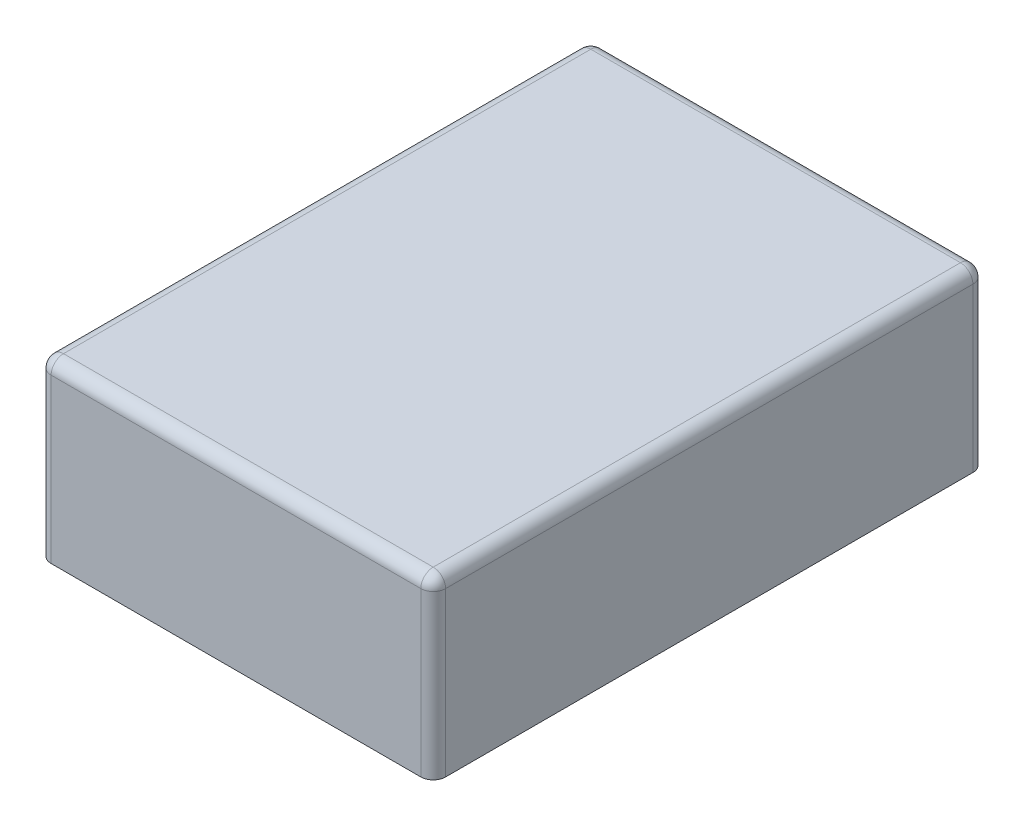
ISO-10303-21;
HEADER;
FILE_DESCRIPTION(('STEP AP214'),'2;1');
FILE_NAME('part.step','',(''),(''),'','','');
FILE_SCHEMA(('AUTOMOTIVE_DESIGN { 1 0 10303 214 1 1 1 1 }'));
ENDSEC;
DATA;
#1=APPLICATION_CONTEXT('core data for automotive mechanical design processes');
#2=APPLICATION_PROTOCOL_DEFINITION('international standard','automotive_design',2000,#1);
#3=PRODUCT_CONTEXT('',#1,'mechanical');
#4=PRODUCT('Part','Part','',(#3));
#5=PRODUCT_RELATED_PRODUCT_CATEGORY('part','',(#4));
#6=PRODUCT_DEFINITION_FORMATION('','',#4);
#7=PRODUCT_DEFINITION_CONTEXT('part definition',#1,'design');
#8=PRODUCT_DEFINITION('design','',#6,#7);
#9=PRODUCT_DEFINITION_SHAPE('','',#8);
#10=(LENGTH_UNIT() NAMED_UNIT(*) SI_UNIT(.MILLI.,.METRE.));
#11=(NAMED_UNIT(*) PLANE_ANGLE_UNIT() SI_UNIT($,.RADIAN.));
#12=(NAMED_UNIT(*) SI_UNIT($,.STERADIAN.) SOLID_ANGLE_UNIT());
#13=UNCERTAINTY_MEASURE_WITH_UNIT(LENGTH_MEASURE(1.E-05),#10,'distance_accuracy_value','');
#14=(GEOMETRIC_REPRESENTATION_CONTEXT(3) GLOBAL_UNCERTAINTY_ASSIGNED_CONTEXT((#13)) GLOBAL_UNIT_ASSIGNED_CONTEXT((#10,
#11,#12)) REPRESENTATION_CONTEXT('',''));
#15=CARTESIAN_POINT('',(0.,0.,0.));
#16=DIRECTION('',(0.,0.,1.));
#17=DIRECTION('',(1.,0.,0.));
#18=AXIS2_PLACEMENT_3D('',#15,#16,#17);
#19=CARTESIAN_POINT('',(0.,0.,0.));
#20=DIRECTION('',(0.,1.,0.));
#21=DIRECTION('',(0.,0.,1.));
#22=AXIS2_PLACEMENT_3D('',#19,#20,#21);
#23=PLANE('',#22);
#24=DIRECTION('',(1.,0.,0.));
#25=VECTOR('',#24,1.);
#26=CARTESIAN_POINT('',(-45.2445008433846,0.,67.0766360111808));
#27=LINE('',#26,#25);
#28=CARTESIAN_POINT('',(-45.2445008433846,0.,67.0766360111808));
#29=VERTEX_POINT('',#28);
#30=CARTESIAN_POINT('',(44.1554991566154,0.,67.0766360111808));
#31=VERTEX_POINT('',#30);
#32=EDGE_CURVE('E213',#29,#31,#27,.T.);
#33=ORIENTED_EDGE('',*,*,#32,.F.);
#34=CARTESIAN_POINT('',(-45.2445008433846,0.,64.0766360111808));
#35=DIRECTION('',(0.,1.,0.));
#36=DIRECTION('',(0.,0.,1.));
#37=AXIS2_PLACEMENT_3D('',#34,#35,#36);
#38=CIRCLE('',#37,3.);
#39=CARTESIAN_POINT('',(-48.2445008433846,0.,64.0766360111808));
#40=VERTEX_POINT('',#39);
#41=EDGE_CURVE('E227',#29,#40,#38,.F.);
#42=ORIENTED_EDGE('',*,*,#41,.T.);
#43=DIRECTION('',(0.,0.,1.));
#44=VECTOR('',#43,1.);
#45=CARTESIAN_POINT('',(-48.2445008433846,0.,-63.4233639888192));
#46=LINE('',#45,#44);
#47=CARTESIAN_POINT('',(-48.2445008433846,0.,-63.4233639888192));
#48=VERTEX_POINT('',#47);
#49=EDGE_CURVE('E210',#48,#40,#46,.T.);
#50=ORIENTED_EDGE('',*,*,#49,.F.);
#51=CARTESIAN_POINT('',(-45.2445008433846,0.,-63.4233639888192));
#52=DIRECTION('',(0.,1.,0.));
#53=DIRECTION('',(0.,0.,1.));
#54=AXIS2_PLACEMENT_3D('',#51,#52,#53);
#55=CIRCLE('',#54,3.);
#56=CARTESIAN_POINT('',(-45.2445008433846,0.,-66.4233639888192));
#57=VERTEX_POINT('',#56);
#58=EDGE_CURVE('E221',#48,#57,#55,.F.);
#59=ORIENTED_EDGE('',*,*,#58,.T.);
#60=DIRECTION('',(-1.,0.,0.));
#61=VECTOR('',#60,1.);
#62=CARTESIAN_POINT('',(-45.2445008433846,0.,-66.4233639888192));
#63=LINE('',#62,#61);
#64=CARTESIAN_POINT('',(44.1554991566154,0.,-66.4233639888192));
#65=VERTEX_POINT('',#64);
#66=EDGE_CURVE('E207',#65,#57,#63,.T.);
#67=ORIENTED_EDGE('',*,*,#66,.F.);
#68=CARTESIAN_POINT('',(44.1554991566154,0.,-63.4233639888192));
#69=DIRECTION('',(0.,1.,0.));
#70=DIRECTION('',(0.,0.,1.));
#71=AXIS2_PLACEMENT_3D('',#68,#69,#70);
#72=CIRCLE('',#71,3.);
#73=CARTESIAN_POINT('',(47.1554991566154,0.,-63.4233639888192));
#74=VERTEX_POINT('',#73);
#75=EDGE_CURVE('E223',#65,#74,#72,.F.);
#76=ORIENTED_EDGE('',*,*,#75,.T.);
#77=DIRECTION('',(0.,0.,-1.));
#78=VECTOR('',#77,1.);
#79=CARTESIAN_POINT('',(47.1554991566154,0.,-63.4233639888192));
#80=LINE('',#79,#78);
#81=CARTESIAN_POINT('',(47.1554991566154,0.,64.0766360111808));
#82=VERTEX_POINT('',#81);
#83=EDGE_CURVE('E204',#82,#74,#80,.T.);
#84=ORIENTED_EDGE('',*,*,#83,.F.);
#85=CARTESIAN_POINT('',(44.1554991566154,0.,64.0766360111808));
#86=DIRECTION('',(0.,1.,0.));
#87=DIRECTION('',(0.,0.,1.));
#88=AXIS2_PLACEMENT_3D('',#85,#86,#87);
#89=CIRCLE('',#88,3.);
#90=EDGE_CURVE('E225',#82,#31,#89,.F.);
#91=ORIENTED_EDGE('',*,*,#90,.T.);
#92=EDGE_LOOP('',(#33,#42,#50,#59,#67,#76,#84,#91));
#93=FACE_BOUND('',#92,.T.);
#94=DIRECTION('',(0.,0.,-1.));
#95=VECTOR('',#94,1.);
#96=CARTESIAN_POINT('',(44.1554991566154,0.,-63.4233639888192));
#97=LINE('',#96,#95);
#98=CARTESIAN_POINT('',(44.1554991566154,0.,64.0766360111808));
#99=VERTEX_POINT('',#98);
#100=CARTESIAN_POINT('',(44.1554991566154,0.,-63.4233639888192));
#101=VERTEX_POINT('',#100);
#102=EDGE_CURVE('E190',#99,#101,#97,.T.);
#103=ORIENTED_EDGE('',*,*,#102,.T.);
#104=DIRECTION('',(-1.,0.,0.));
#105=VECTOR('',#104,1.);
#106=CARTESIAN_POINT('',(-45.2445008433846,0.,-63.4233639888192));
#107=LINE('',#106,#105);
#108=CARTESIAN_POINT('',(-45.2445008433846,0.,-63.4233639888192));
#109=VERTEX_POINT('',#108);
#110=EDGE_CURVE('E193',#101,#109,#107,.T.);
#111=ORIENTED_EDGE('',*,*,#110,.T.);
#112=DIRECTION('',(0.,0.,1.));
#113=VECTOR('',#112,1.);
#114=CARTESIAN_POINT('',(-45.2445008433846,0.,-63.4233639888192));
#115=LINE('',#114,#113);
#116=CARTESIAN_POINT('',(-45.2445008433846,0.,64.0766360111808));
#117=VERTEX_POINT('',#116);
#118=EDGE_CURVE('E196',#109,#117,#115,.T.);
#119=ORIENTED_EDGE('',*,*,#118,.T.);
#120=DIRECTION('',(1.,0.,0.));
#121=VECTOR('',#120,1.);
#122=CARTESIAN_POINT('',(-45.2445008433846,0.,64.0766360111808));
#123=LINE('',#122,#121);
#124=EDGE_CURVE('E177',#117,#99,#123,.T.);
#125=ORIENTED_EDGE('',*,*,#124,.T.);
#126=EDGE_LOOP('',(#103,#111,#119,#125));
#127=FACE_BOUND('',#126,.T.);
#128=ADVANCED_FACE('F59',(#93,#127),#23,.F.);
#129=CARTESIAN_POINT('',(47.1554991566154,37.45,-63.4233639888192));
#130=DIRECTION('',(-1.,0.,0.));
#131=DIRECTION('',(0.,0.,1.));
#132=AXIS2_PLACEMENT_3D('',#129,#130,#131);
#133=PLANE('',#132);
#134=DIRECTION('',(0.,-1.,0.));
#135=VECTOR('',#134,1.);
#136=CARTESIAN_POINT('',(47.1554991566154,37.45,-63.4233639888192));
#137=LINE('',#136,#135);
#138=CARTESIAN_POINT('',(47.1554991566154,39.45,-63.4233639888192));
#139=VERTEX_POINT('',#138);
#140=EDGE_CURVE('E234',#74,#139,#137,.F.);
#141=ORIENTED_EDGE('',*,*,#140,.T.);
#142=DIRECTION('',(0.,0.,-1.));
#143=VECTOR('',#142,1.);
#144=CARTESIAN_POINT('',(47.1554991566154,39.45,64.0766360111808));
#145=LINE('',#144,#143);
#146=CARTESIAN_POINT('',(47.1554991566154,39.45,64.0766360111808));
#147=VERTEX_POINT('',#146);
#148=EDGE_CURVE('E259',#139,#147,#145,.F.);
#149=ORIENTED_EDGE('',*,*,#148,.T.);
#150=DIRECTION('',(0.,-1.,0.));
#151=VECTOR('',#150,1.);
#152=CARTESIAN_POINT('',(47.1554991566154,37.45,64.0766360111808));
#153=LINE('',#152,#151);
#154=EDGE_CURVE('E237',#147,#82,#153,.T.);
#155=ORIENTED_EDGE('',*,*,#154,.T.);
#156=ORIENTED_EDGE('',*,*,#83,.T.);
#157=EDGE_LOOP('',(#141,#149,#155,#156));
#158=FACE_BOUND('',#157,.T.);
#159=ADVANCED_FACE('F352',(#158),#133,.F.);
#160=CARTESIAN_POINT('',(-45.2445008433846,37.45,-66.4233639888192));
#161=DIRECTION('',(0.,0.,1.));
#162=DIRECTION('',(1.,0.,0.));
#163=AXIS2_PLACEMENT_3D('',#160,#161,#162);
#164=PLANE('',#163);
#165=DIRECTION('',(0.,-1.,0.));
#166=VECTOR('',#165,1.);
#167=CARTESIAN_POINT('',(-45.2445008433846,37.45,-66.4233639888192));
#168=LINE('',#167,#166);
#169=CARTESIAN_POINT('',(-45.2445008433846,39.45,-66.4233639888192));
#170=VERTEX_POINT('',#169);
#171=EDGE_CURVE('E239',#57,#170,#168,.F.);
#172=ORIENTED_EDGE('',*,*,#171,.T.);
#173=DIRECTION('',(-1.,0.,0.));
#174=VECTOR('',#173,1.);
#175=CARTESIAN_POINT('',(44.1554991566154,39.45,-66.4233639888192));
#176=LINE('',#175,#174);
#177=CARTESIAN_POINT('',(44.1554991566154,39.45,-66.4233639888192));
#178=VERTEX_POINT('',#177);
#179=EDGE_CURVE('E12',#170,#178,#176,.F.);
#180=ORIENTED_EDGE('',*,*,#179,.T.);
#181=DIRECTION('',(0.,-1.,0.));
#182=VECTOR('',#181,1.);
#183=CARTESIAN_POINT('',(44.1554991566154,37.45,-66.4233639888192));
#184=LINE('',#183,#182);
#185=EDGE_CURVE('E242',#178,#65,#184,.T.);
#186=ORIENTED_EDGE('',*,*,#185,.T.);
#187=ORIENTED_EDGE('',*,*,#66,.T.);
#188=EDGE_LOOP('',(#172,#180,#186,#187));
#189=FACE_BOUND('',#188,.T.);
#190=ADVANCED_FACE('F335',(#189),#164,.F.);
#191=CARTESIAN_POINT('',(-48.2445008433846,37.45,-63.4233639888192));
#192=DIRECTION('',(1.,0.,0.));
#193=DIRECTION('',(0.,0.,-1.));
#194=AXIS2_PLACEMENT_3D('',#191,#192,#193);
#195=PLANE('',#194);
#196=DIRECTION('',(0.,-1.,0.));
#197=VECTOR('',#196,1.);
#198=CARTESIAN_POINT('',(-48.2445008433846,37.45,64.0766360111808));
#199=LINE('',#198,#197);
#200=CARTESIAN_POINT('',(-48.2445008433846,39.45,64.0766360111808));
#201=VERTEX_POINT('',#200);
#202=EDGE_CURVE('E231',#40,#201,#199,.F.);
#203=ORIENTED_EDGE('',*,*,#202,.T.);
#204=DIRECTION('',(0.,0.,1.));
#205=VECTOR('',#204,1.);
#206=CARTESIAN_POINT('',(-48.2445008433846,39.45,-63.4233639888192));
#207=LINE('',#206,#205);
#208=CARTESIAN_POINT('',(-48.2445008433846,39.45,-63.4233639888192));
#209=VERTEX_POINT('',#208);
#210=EDGE_CURVE('E68',#201,#209,#207,.F.);
#211=ORIENTED_EDGE('',*,*,#210,.T.);
#212=DIRECTION('',(0.,-1.,0.));
#213=VECTOR('',#212,1.);
#214=CARTESIAN_POINT('',(-48.2445008433846,37.45,-63.4233639888192));
#215=LINE('',#214,#213);
#216=EDGE_CURVE('E229',#209,#48,#215,.T.);
#217=ORIENTED_EDGE('',*,*,#216,.T.);
#218=ORIENTED_EDGE('',*,*,#49,.T.);
#219=EDGE_LOOP('',(#203,#211,#217,#218));
#220=FACE_BOUND('',#219,.T.);
#221=ADVANCED_FACE('F296',(#220),#195,.F.);
#222=CARTESIAN_POINT('',(-45.2445008433846,37.45,67.0766360111808));
#223=DIRECTION('',(0.,0.,-1.));
#224=DIRECTION('',(-1.,0.,0.));
#225=AXIS2_PLACEMENT_3D('',#222,#223,#224);
#226=PLANE('',#225);
#227=DIRECTION('',(0.,-1.,0.));
#228=VECTOR('',#227,1.);
#229=CARTESIAN_POINT('',(44.1554991566154,37.45,67.0766360111808));
#230=LINE('',#229,#228);
#231=CARTESIAN_POINT('',(44.1554991566154,39.45,67.0766360111808));
#232=VERTEX_POINT('',#231);
#233=EDGE_CURVE('E216',#31,#232,#230,.F.);
#234=ORIENTED_EDGE('',*,*,#233,.T.);
#235=DIRECTION('',(1.,0.,0.));
#236=VECTOR('',#235,1.);
#237=CARTESIAN_POINT('',(-45.2445008433846,39.45,67.0766360111808));
#238=LINE('',#237,#236);
#239=CARTESIAN_POINT('',(-45.2445008433846,39.45,67.0766360111808));
#240=VERTEX_POINT('',#239);
#241=EDGE_CURVE('E261',#232,#240,#238,.F.);
#242=ORIENTED_EDGE('',*,*,#241,.T.);
#243=DIRECTION('',(0.,-1.,0.));
#244=VECTOR('',#243,1.);
#245=CARTESIAN_POINT('',(-45.2445008433846,37.45,67.0766360111808));
#246=LINE('',#245,#244);
#247=EDGE_CURVE('E219',#240,#29,#246,.T.);
#248=ORIENTED_EDGE('',*,*,#247,.T.);
#249=ORIENTED_EDGE('',*,*,#32,.T.);
#250=EDGE_LOOP('',(#234,#242,#248,#249));
#251=FACE_BOUND('',#250,.T.);
#252=ADVANCED_FACE('F308',(#251),#226,.F.);
#253=CARTESIAN_POINT('',(44.1554991566154,37.45,-63.4233639888192));
#254=DIRECTION('',(-1.,0.,0.));
#255=DIRECTION('',(0.,0.,1.));
#256=AXIS2_PLACEMENT_3D('',#253,#254,#255);
#257=PLANE('',#256);
#258=ORIENTED_EDGE('',*,*,#102,.F.);
#259=DIRECTION('',(0.,-1.,0.));
#260=VECTOR('',#259,1.);
#261=CARTESIAN_POINT('',(44.1554991566154,37.45,64.0766360111808));
#262=LINE('',#261,#260);
#263=CARTESIAN_POINT('',(44.1554991566154,37.45,64.0766360111808));
#264=VERTEX_POINT('',#263);
#265=EDGE_CURVE('E171',#264,#99,#262,.T.);
#266=ORIENTED_EDGE('',*,*,#265,.F.);
#267=DIRECTION('',(0.,0.,-1.));
#268=VECTOR('',#267,1.);
#269=CARTESIAN_POINT('',(44.1554991566154,37.45,-63.4233639888192));
#270=LINE('',#269,#268);
#271=CARTESIAN_POINT('',(44.1554991566154,37.45,-63.4233639888192));
#272=VERTEX_POINT('',#271);
#273=EDGE_CURVE('E167',#264,#272,#270,.T.);
#274=ORIENTED_EDGE('',*,*,#273,.T.);
#275=DIRECTION('',(0.,-1.,0.));
#276=VECTOR('',#275,1.);
#277=CARTESIAN_POINT('',(44.1554991566154,37.45,-63.4233639888192));
#278=LINE('',#277,#276);
#279=EDGE_CURVE('E201',#272,#101,#278,.T.);
#280=ORIENTED_EDGE('',*,*,#279,.T.);
#281=EDGE_LOOP('',(#258,#266,#274,#280));
#282=FACE_BOUND('',#281,.T.);
#283=ADVANCED_FACE('F361',(#282),#257,.T.);
#284=CARTESIAN_POINT('',(-45.2445008433846,37.45,-63.4233639888192));
#285=DIRECTION('',(0.,0.,1.));
#286=DIRECTION('',(1.,0.,0.));
#287=AXIS2_PLACEMENT_3D('',#284,#285,#286);
#288=PLANE('',#287);
#289=ORIENTED_EDGE('',*,*,#110,.F.);
#290=ORIENTED_EDGE('',*,*,#279,.F.);
#291=DIRECTION('',(-1.,0.,0.));
#292=VECTOR('',#291,1.);
#293=CARTESIAN_POINT('',(-45.2445008433846,37.45,-63.4233639888192));
#294=LINE('',#293,#292);
#295=CARTESIAN_POINT('',(-45.2445008433846,37.45,-63.4233639888192));
#296=VERTEX_POINT('',#295);
#297=EDGE_CURVE('E185',#272,#296,#294,.T.);
#298=ORIENTED_EDGE('',*,*,#297,.T.);
#299=DIRECTION('',(0.,-1.,0.));
#300=VECTOR('',#299,1.);
#301=CARTESIAN_POINT('',(-45.2445008433846,37.45,-63.4233639888192));
#302=LINE('',#301,#300);
#303=EDGE_CURVE('E181',#296,#109,#302,.T.);
#304=ORIENTED_EDGE('',*,*,#303,.T.);
#305=EDGE_LOOP('',(#289,#290,#298,#304));
#306=FACE_BOUND('',#305,.T.);
#307=ADVANCED_FACE('F527',(#306),#288,.T.);
#308=CARTESIAN_POINT('',(-45.2445008433846,37.45,-63.4233639888192));
#309=DIRECTION('',(1.,0.,0.));
#310=DIRECTION('',(0.,0.,-1.));
#311=AXIS2_PLACEMENT_3D('',#308,#309,#310);
#312=PLANE('',#311);
#313=ORIENTED_EDGE('',*,*,#118,.F.);
#314=ORIENTED_EDGE('',*,*,#303,.F.);
#315=DIRECTION('',(0.,0.,1.));
#316=VECTOR('',#315,1.);
#317=CARTESIAN_POINT('',(-45.2445008433846,37.45,-63.4233639888192));
#318=LINE('',#317,#316);
#319=CARTESIAN_POINT('',(-45.2445008433846,37.45,64.0766360111808));
#320=VERTEX_POINT('',#319);
#321=EDGE_CURVE('E164',#296,#320,#318,.T.);
#322=ORIENTED_EDGE('',*,*,#321,.T.);
#323=DIRECTION('',(0.,-1.,0.));
#324=VECTOR('',#323,1.);
#325=CARTESIAN_POINT('',(-45.2445008433846,37.45,64.0766360111808));
#326=LINE('',#325,#324);
#327=EDGE_CURVE('E174',#320,#117,#326,.T.);
#328=ORIENTED_EDGE('',*,*,#327,.T.);
#329=EDGE_LOOP('',(#313,#314,#322,#328));
#330=FACE_BOUND('',#329,.T.);
#331=ADVANCED_FACE('F184',(#330),#312,.T.);
#332=CARTESIAN_POINT('',(-45.2445008433846,37.45,64.0766360111808));
#333=DIRECTION('',(0.,0.,-1.));
#334=DIRECTION('',(-1.,0.,0.));
#335=AXIS2_PLACEMENT_3D('',#332,#333,#334);
#336=PLANE('',#335);
#337=ORIENTED_EDGE('',*,*,#124,.F.);
#338=ORIENTED_EDGE('',*,*,#327,.F.);
#339=DIRECTION('',(1.,0.,0.));
#340=VECTOR('',#339,1.);
#341=CARTESIAN_POINT('',(-45.2445008433846,37.45,64.0766360111808));
#342=LINE('',#341,#340);
#343=EDGE_CURVE('E160',#320,#264,#342,.T.);
#344=ORIENTED_EDGE('',*,*,#343,.T.);
#345=ORIENTED_EDGE('',*,*,#265,.T.);
#346=EDGE_LOOP('',(#337,#338,#344,#345));
#347=FACE_BOUND('',#346,.T.);
#348=ADVANCED_FACE('F175',(#347),#336,.T.);
#349=CARTESIAN_POINT('',(0.,37.45,0.));
#350=DIRECTION('',(0.,1.,0.));
#351=DIRECTION('',(0.,0.,1.));
#352=AXIS2_PLACEMENT_3D('',#349,#350,#351);
#353=PLANE('',#352);
#354=ORIENTED_EDGE('',*,*,#273,.F.);
#355=ORIENTED_EDGE('',*,*,#343,.F.);
#356=ORIENTED_EDGE('',*,*,#321,.F.);
#357=ORIENTED_EDGE('',*,*,#297,.F.);
#358=EDGE_LOOP('',(#354,#355,#356,#357));
#359=FACE_BOUND('',#358,.T.);
#360=ADVANCED_FACE('F162',(#359),#353,.F.);
#361=CARTESIAN_POINT('',(0.,42.45,0.));
#362=DIRECTION('',(0.,1.,0.));
#363=DIRECTION('',(0.,0.,1.));
#364=AXIS2_PLACEMENT_3D('',#361,#362,#363);
#365=PLANE('',#364);
#366=DIRECTION('',(1.,0.,0.));
#367=VECTOR('',#366,1.);
#368=CARTESIAN_POINT('',(44.1554991566154,42.45,64.0766360111808));
#369=LINE('',#368,#367);
#370=CARTESIAN_POINT('',(-45.2445008433846,42.45,64.0766360111808));
#371=VERTEX_POINT('',#370);
#372=CARTESIAN_POINT('',(44.1554991566154,42.45,64.0766360111808));
#373=VERTEX_POINT('',#372);
#374=EDGE_CURVE('E76',#371,#373,#369,.T.);
#375=ORIENTED_EDGE('',*,*,#374,.T.);
#376=DIRECTION('',(0.,0.,-1.));
#377=VECTOR('',#376,1.);
#378=CARTESIAN_POINT('',(44.1554991566154,42.45,-63.4233639888192));
#379=LINE('',#378,#377);
#380=CARTESIAN_POINT('',(44.1554991566154,42.45,-63.4233639888192));
#381=VERTEX_POINT('',#380);
#382=EDGE_CURVE('E257',#373,#381,#379,.T.);
#383=ORIENTED_EDGE('',*,*,#382,.T.);
#384=DIRECTION('',(-1.,0.,0.));
#385=VECTOR('',#384,1.);
#386=CARTESIAN_POINT('',(-45.2445008433846,42.45,-63.4233639888192));
#387=LINE('',#386,#385);
#388=CARTESIAN_POINT('',(-45.2445008433846,42.45,-63.4233639888192));
#389=VERTEX_POINT('',#388);
#390=EDGE_CURVE('E253',#381,#389,#387,.T.);
#391=ORIENTED_EDGE('',*,*,#390,.T.);
#392=DIRECTION('',(0.,0.,1.));
#393=VECTOR('',#392,1.);
#394=CARTESIAN_POINT('',(-45.2445008433846,42.45,64.0766360111808));
#395=LINE('',#394,#393);
#396=EDGE_CURVE('E81',#389,#371,#395,.T.);
#397=ORIENTED_EDGE('',*,*,#396,.T.);
#398=EDGE_LOOP('',(#375,#383,#391,#397));
#399=FACE_BOUND('',#398,.T.);
#400=ADVANCED_FACE('F322',(#399),#365,.T.);
#401=CARTESIAN_POINT('',(-45.2445008433846,37.45,64.0766360111808));
#402=DIRECTION('',(0.,-1.,0.));
#403=DIRECTION('',(0.,0.,-1.));
#404=AXIS2_PLACEMENT_3D('',#401,#402,#403);
#405=CYLINDRICAL_SURFACE('',#404,3.);
#406=ORIENTED_EDGE('',*,*,#247,.F.);
#407=CARTESIAN_POINT('',(-45.2445008433846,39.45,64.0766360111808));
#408=DIRECTION('',(0.,-1.,0.));
#409=DIRECTION('',(0.,0.,-1.));
#410=AXIS2_PLACEMENT_3D('',#407,#408,#409);
#411=CIRCLE('',#410,3.);
#412=EDGE_CURVE('E249',#240,#201,#411,.T.);
#413=ORIENTED_EDGE('',*,*,#412,.T.);
#414=ORIENTED_EDGE('',*,*,#202,.F.);
#415=ORIENTED_EDGE('',*,*,#41,.F.);
#416=EDGE_LOOP('',(#406,#413,#414,#415));
#417=FACE_BOUND('',#416,.T.);
#418=ADVANCED_FACE('F293',(#417),#405,.T.);
#419=CARTESIAN_POINT('',(44.1554991566154,37.45,64.0766360111808));
#420=DIRECTION('',(0.,-1.,0.));
#421=DIRECTION('',(0.,0.,-1.));
#422=AXIS2_PLACEMENT_3D('',#419,#420,#421);
#423=CYLINDRICAL_SURFACE('',#422,3.);
#424=ORIENTED_EDGE('',*,*,#154,.F.);
#425=CARTESIAN_POINT('',(44.1554991566154,39.45,64.0766360111808));
#426=DIRECTION('',(0.,-1.,0.));
#427=DIRECTION('',(0.,0.,-1.));
#428=AXIS2_PLACEMENT_3D('',#425,#426,#427);
#429=CIRCLE('',#428,3.);
#430=EDGE_CURVE('E247',#147,#232,#429,.T.);
#431=ORIENTED_EDGE('',*,*,#430,.T.);
#432=ORIENTED_EDGE('',*,*,#233,.F.);
#433=ORIENTED_EDGE('',*,*,#90,.F.);
#434=EDGE_LOOP('',(#424,#431,#432,#433));
#435=FACE_BOUND('',#434,.T.);
#436=ADVANCED_FACE('F311',(#435),#423,.T.);
#437=CARTESIAN_POINT('',(44.1554991566154,37.45,-63.4233639888192));
#438=DIRECTION('',(0.,-1.,0.));
#439=DIRECTION('',(0.,0.,-1.));
#440=AXIS2_PLACEMENT_3D('',#437,#438,#439);
#441=CYLINDRICAL_SURFACE('',#440,3.);
#442=ORIENTED_EDGE('',*,*,#185,.F.);
#443=CARTESIAN_POINT('',(44.1554991566154,39.45,-63.4233639888192));
#444=DIRECTION('',(0.,-1.,0.));
#445=DIRECTION('',(0.,0.,-1.));
#446=AXIS2_PLACEMENT_3D('',#443,#444,#445);
#447=CIRCLE('',#446,3.);
#448=EDGE_CURVE('E244',#178,#139,#447,.T.);
#449=ORIENTED_EDGE('',*,*,#448,.T.);
#450=ORIENTED_EDGE('',*,*,#140,.F.);
#451=ORIENTED_EDGE('',*,*,#75,.F.);
#452=EDGE_LOOP('',(#442,#449,#450,#451));
#453=FACE_BOUND('',#452,.T.);
#454=ADVANCED_FACE('F340',(#453),#441,.T.);
#455=CARTESIAN_POINT('',(-45.2445008433846,37.45,-63.4233639888192));
#456=DIRECTION('',(0.,-1.,0.));
#457=DIRECTION('',(0.,0.,-1.));
#458=AXIS2_PLACEMENT_3D('',#455,#456,#457);
#459=CYLINDRICAL_SURFACE('',#458,3.);
#460=ORIENTED_EDGE('',*,*,#216,.F.);
#461=CARTESIAN_POINT('',(-45.2445008433846,39.45,-63.4233639888192));
#462=DIRECTION('',(0.,-1.,0.));
#463=DIRECTION('',(0.,0.,-1.));
#464=AXIS2_PLACEMENT_3D('',#461,#462,#463);
#465=CIRCLE('',#464,3.);
#466=EDGE_CURVE('E251',#209,#170,#465,.T.);
#467=ORIENTED_EDGE('',*,*,#466,.T.);
#468=ORIENTED_EDGE('',*,*,#171,.F.);
#469=ORIENTED_EDGE('',*,*,#58,.F.);
#470=EDGE_LOOP('',(#460,#467,#468,#469));
#471=FACE_BOUND('',#470,.T.);
#472=ADVANCED_FACE('F374',(#471),#459,.T.);
#473=CARTESIAN_POINT('',(-45.2445008433846,39.45,64.0766360111808));
#474=DIRECTION('',(0.,1.,0.));
#475=DIRECTION('',(0.,0.,1.));
#476=AXIS2_PLACEMENT_3D('',#473,#474,#475);
#477=SPHERICAL_SURFACE('',#476,3.);
#478=CARTESIAN_POINT('',(-45.2445008433846,39.45,64.0766360111808));
#479=DIRECTION('',(0.,0.,-1.));
#480=DIRECTION('',(-1.,0.,0.));
#481=AXIS2_PLACEMENT_3D('',#478,#479,#480);
#482=CIRCLE('',#481,3.);
#483=EDGE_CURVE('E279',#201,#371,#482,.T.);
#484=ORIENTED_EDGE('',*,*,#483,.F.);
#485=ORIENTED_EDGE('',*,*,#412,.F.);
#486=CARTESIAN_POINT('',(-45.2445008433846,39.45,64.0766360111808));
#487=DIRECTION('',(1.,0.,0.));
#488=DIRECTION('',(0.,0.,-1.));
#489=AXIS2_PLACEMENT_3D('',#486,#487,#488);
#490=CIRCLE('',#489,3.);
#491=EDGE_CURVE('E63',#371,#240,#490,.T.);
#492=ORIENTED_EDGE('',*,*,#491,.F.);
#493=EDGE_LOOP('',(#484,#485,#492));
#494=FACE_BOUND('',#493,.T.);
#495=ADVANCED_FACE('F61',(#494),#477,.T.);
#496=CARTESIAN_POINT('',(0.,39.45,64.0766360111808));
#497=DIRECTION('',(-1.,0.,0.));
#498=DIRECTION('',(0.,0.,1.));
#499=AXIS2_PLACEMENT_3D('',#496,#497,#498);
#500=CYLINDRICAL_SURFACE('',#499,3.);
#501=ORIENTED_EDGE('',*,*,#491,.T.);
#502=ORIENTED_EDGE('',*,*,#241,.F.);
#503=CARTESIAN_POINT('',(44.1554991566154,39.45,64.0766360111808));
#504=DIRECTION('',(1.,0.,0.));
#505=DIRECTION('',(0.,0.,-1.));
#506=AXIS2_PLACEMENT_3D('',#503,#504,#505);
#507=CIRCLE('',#506,3.);
#508=EDGE_CURVE('E277',#373,#232,#507,.T.);
#509=ORIENTED_EDGE('',*,*,#508,.F.);
#510=ORIENTED_EDGE('',*,*,#374,.F.);
#511=EDGE_LOOP('',(#501,#502,#509,#510));
#512=FACE_BOUND('',#511,.T.);
#513=ADVANCED_FACE('F287',(#512),#500,.T.);
#514=CARTESIAN_POINT('',(-45.2445008433846,39.45,0.));
#515=DIRECTION('',(0.,0.,-1.));
#516=DIRECTION('',(-1.,0.,0.));
#517=AXIS2_PLACEMENT_3D('',#514,#515,#516);
#518=CYLINDRICAL_SURFACE('',#517,3.);
#519=ORIENTED_EDGE('',*,*,#483,.T.);
#520=ORIENTED_EDGE('',*,*,#396,.F.);
#521=CARTESIAN_POINT('',(-45.2445008433846,39.45,-63.4233639888192));
#522=DIRECTION('',(0.,0.,-1.));
#523=DIRECTION('',(-1.,0.,0.));
#524=AXIS2_PLACEMENT_3D('',#521,#522,#523);
#525=CIRCLE('',#524,3.);
#526=EDGE_CURVE('E274',#209,#389,#525,.T.);
#527=ORIENTED_EDGE('',*,*,#526,.F.);
#528=ORIENTED_EDGE('',*,*,#210,.F.);
#529=EDGE_LOOP('',(#519,#520,#527,#528));
#530=FACE_BOUND('',#529,.T.);
#531=ADVANCED_FACE('F326',(#530),#518,.T.);
#532=CARTESIAN_POINT('',(44.1554991566154,39.45,64.0766360111808));
#533=DIRECTION('',(0.,1.,0.));
#534=DIRECTION('',(0.,0.,1.));
#535=AXIS2_PLACEMENT_3D('',#532,#533,#534);
#536=SPHERICAL_SURFACE('',#535,3.);
#537=ORIENTED_EDGE('',*,*,#508,.T.);
#538=ORIENTED_EDGE('',*,*,#430,.F.);
#539=CARTESIAN_POINT('',(44.1554991566154,39.45,64.0766360111808));
#540=DIRECTION('',(0.,0.,-1.));
#541=DIRECTION('',(-1.,0.,0.));
#542=AXIS2_PLACEMENT_3D('',#539,#540,#541);
#543=CIRCLE('',#542,3.);
#544=EDGE_CURVE('E271',#373,#147,#543,.T.);
#545=ORIENTED_EDGE('',*,*,#544,.F.);
#546=EDGE_LOOP('',(#537,#538,#545));
#547=FACE_BOUND('',#546,.T.);
#548=ADVANCED_FACE('F315',(#547),#536,.T.);
#549=CARTESIAN_POINT('',(-45.2445008433846,39.45,-63.4233639888192));
#550=DIRECTION('',(0.,1.,0.));
#551=DIRECTION('',(0.,0.,1.));
#552=AXIS2_PLACEMENT_3D('',#549,#550,#551);
#553=SPHERICAL_SURFACE('',#552,3.);
#554=ORIENTED_EDGE('',*,*,#466,.F.);
#555=ORIENTED_EDGE('',*,*,#526,.T.);
#556=CARTESIAN_POINT('',(-45.2445008433846,39.45,-63.4233639888192));
#557=DIRECTION('',(1.,0.,0.));
#558=DIRECTION('',(0.,0.,-1.));
#559=AXIS2_PLACEMENT_3D('',#556,#557,#558);
#560=CIRCLE('',#559,3.);
#561=EDGE_CURVE('E268',#170,#389,#560,.T.);
#562=ORIENTED_EDGE('',*,*,#561,.F.);
#563=EDGE_LOOP('',(#554,#555,#562));
#564=FACE_BOUND('',#563,.T.);
#565=ADVANCED_FACE('F330',(#564),#553,.T.);
#566=CARTESIAN_POINT('',(44.1554991566154,39.45,0.));
#567=DIRECTION('',(0.,0.,1.));
#568=DIRECTION('',(1.,0.,0.));
#569=AXIS2_PLACEMENT_3D('',#566,#567,#568);
#570=CYLINDRICAL_SURFACE('',#569,3.);
#571=ORIENTED_EDGE('',*,*,#544,.T.);
#572=ORIENTED_EDGE('',*,*,#148,.F.);
#573=CARTESIAN_POINT('',(44.1554991566154,39.45,-63.4233639888192));
#574=DIRECTION('',(0.,0.,-1.));
#575=DIRECTION('',(-1.,0.,0.));
#576=AXIS2_PLACEMENT_3D('',#573,#574,#575);
#577=CIRCLE('',#576,3.);
#578=EDGE_CURVE('E266',#381,#139,#577,.T.);
#579=ORIENTED_EDGE('',*,*,#578,.F.);
#580=ORIENTED_EDGE('',*,*,#382,.F.);
#581=EDGE_LOOP('',(#571,#572,#579,#580));
#582=FACE_BOUND('',#581,.T.);
#583=ADVANCED_FACE('F319',(#582),#570,.T.);
#584=CARTESIAN_POINT('',(0.,39.45,-63.4233639888192));
#585=DIRECTION('',(1.,0.,0.));
#586=DIRECTION('',(0.,0.,-1.));
#587=AXIS2_PLACEMENT_3D('',#584,#585,#586);
#588=CYLINDRICAL_SURFACE('',#587,3.);
#589=ORIENTED_EDGE('',*,*,#561,.T.);
#590=ORIENTED_EDGE('',*,*,#390,.F.);
#591=CARTESIAN_POINT('',(44.1554991566154,39.45,-63.4233639888192));
#592=DIRECTION('',(1.,0.,0.));
#593=DIRECTION('',(0.,0.,-1.));
#594=AXIS2_PLACEMENT_3D('',#591,#592,#593);
#595=CIRCLE('',#594,3.);
#596=EDGE_CURVE('E264',#178,#381,#595,.T.);
#597=ORIENTED_EDGE('',*,*,#596,.F.);
#598=ORIENTED_EDGE('',*,*,#179,.F.);
#599=EDGE_LOOP('',(#589,#590,#597,#598));
#600=FACE_BOUND('',#599,.T.);
#601=ADVANCED_FACE('F332',(#600),#588,.T.);
#602=CARTESIAN_POINT('',(44.1554991566154,39.45,-63.4233639888192));
#603=DIRECTION('',(0.,1.,0.));
#604=DIRECTION('',(0.,0.,1.));
#605=AXIS2_PLACEMENT_3D('',#602,#603,#604);
#606=SPHERICAL_SURFACE('',#605,3.);
#607=ORIENTED_EDGE('',*,*,#578,.T.);
#608=ORIENTED_EDGE('',*,*,#448,.F.);
#609=ORIENTED_EDGE('',*,*,#596,.T.);
#610=EDGE_LOOP('',(#607,#608,#609));
#611=FACE_BOUND('',#610,.T.);
#612=ADVANCED_FACE('F343',(#611),#606,.T.);
#613=CLOSED_SHELL('',(#128,#159,#190,#221,#252,#283,#307,#331,#348,#360,#400,#418,#436,#454,
#472,#495,#513,#531,#548,#565,#583,#601,#612));
#614=MANIFOLD_SOLID_BREP('B2',#613);
#615=ADVANCED_BREP_SHAPE_REPRESENTATION('',(#18,#614),#14);
#616=SHAPE_DEFINITION_REPRESENTATION(#9,#615);
ENDSEC;
END-ISO-10303-21;
